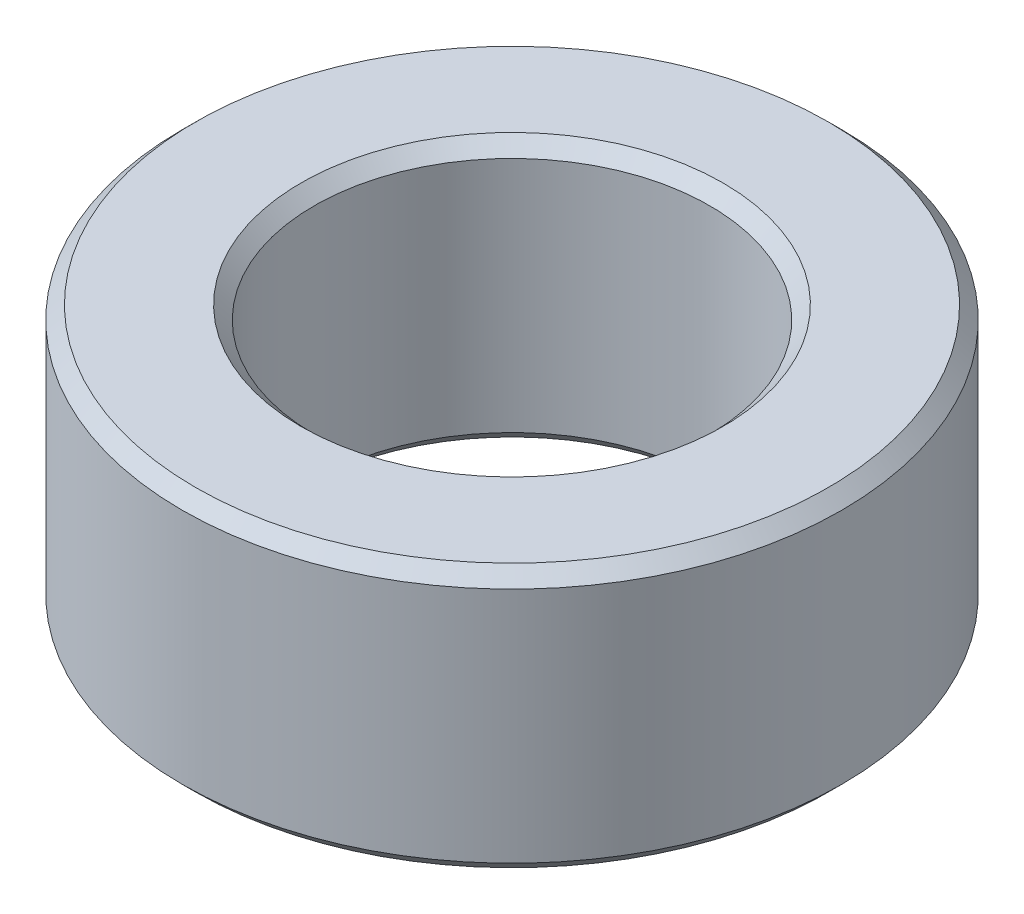
ISO-10303-21;
HEADER;
FILE_DESCRIPTION(('STEP AP214'),'2;1');
FILE_NAME('part.step','',(''),(''),'','','');
FILE_SCHEMA(('AUTOMOTIVE_DESIGN { 1 0 10303 214 1 1 1 1 }'));
ENDSEC;
DATA;
#1=APPLICATION_CONTEXT('core data for automotive mechanical design processes');
#2=APPLICATION_PROTOCOL_DEFINITION('international standard','automotive_design',2000,#1);
#3=PRODUCT_CONTEXT('',#1,'mechanical');
#4=PRODUCT('Part','Part','',(#3));
#5=PRODUCT_RELATED_PRODUCT_CATEGORY('part','',(#4));
#6=PRODUCT_DEFINITION_FORMATION('','',#4);
#7=PRODUCT_DEFINITION_CONTEXT('part definition',#1,'design');
#8=PRODUCT_DEFINITION('design','',#6,#7);
#9=PRODUCT_DEFINITION_SHAPE('','',#8);
#10=(LENGTH_UNIT() NAMED_UNIT(*) SI_UNIT(.MILLI.,.METRE.));
#11=(NAMED_UNIT(*) PLANE_ANGLE_UNIT() SI_UNIT($,.RADIAN.));
#12=(NAMED_UNIT(*) SI_UNIT($,.STERADIAN.) SOLID_ANGLE_UNIT());
#13=UNCERTAINTY_MEASURE_WITH_UNIT(LENGTH_MEASURE(1.E-05),#10,'distance_accuracy_value','');
#14=(GEOMETRIC_REPRESENTATION_CONTEXT(3) GLOBAL_UNCERTAINTY_ASSIGNED_CONTEXT((#13)) GLOBAL_UNIT_ASSIGNED_CONTEXT((#10,
#11,#12)) REPRESENTATION_CONTEXT('',''));
#15=CARTESIAN_POINT('',(0.,0.,0.));
#16=DIRECTION('',(0.,0.,1.));
#17=DIRECTION('',(1.,0.,0.));
#18=AXIS2_PLACEMENT_3D('',#15,#16,#17);
#19=CARTESIAN_POINT('',(0.,4.,0.));
#20=DIRECTION('',(0.,-1.,0.));
#21=DIRECTION('',(0.,0.,-1.));
#22=AXIS2_PLACEMENT_3D('',#19,#20,#21);
#23=CYLINDRICAL_SURFACE('',#22,3.);
#24=CARTESIAN_POINT('',(0.,0.200000000000001,0.));
#25=DIRECTION('',(0.,1.,0.));
#26=DIRECTION('',(0.,0.,1.));
#27=AXIS2_PLACEMENT_3D('',#24,#25,#26);
#28=CIRCLE('',#27,3.);
#29=CARTESIAN_POINT('',(0.,0.200000000000001,3.));
#30=VERTEX_POINT('',#29);
#31=EDGE_CURVE('E63',#30,#30,#28,.F.);
#32=ORIENTED_EDGE('',*,*,#31,.T.);
#33=EDGE_LOOP('',(#32));
#34=FACE_BOUND('',#33,.T.);
#35=CARTESIAN_POINT('',(0.,3.8,0.));
#36=DIRECTION('',(0.,1.,0.));
#37=DIRECTION('',(0.,0.,1.));
#38=AXIS2_PLACEMENT_3D('',#35,#36,#37);
#39=CIRCLE('',#38,3.);
#40=CARTESIAN_POINT('',(0.,3.8,3.));
#41=VERTEX_POINT('',#40);
#42=EDGE_CURVE('E67',#41,#41,#39,.T.);
#43=ORIENTED_EDGE('',*,*,#42,.T.);
#44=EDGE_LOOP('',(#43));
#45=FACE_BOUND('',#44,.T.);
#46=ADVANCED_FACE('F39',(#34,#45),#23,.F.);
#47=CARTESIAN_POINT('',(0.,4.,0.));
#48=DIRECTION('',(0.,-1.,0.));
#49=DIRECTION('',(0.,0.,-1.));
#50=AXIS2_PLACEMENT_3D('',#47,#48,#49);
#51=CYLINDRICAL_SURFACE('',#50,5.);
#52=CARTESIAN_POINT('',(0.,0.200000000000001,0.));
#53=DIRECTION('',(0.,1.,0.));
#54=DIRECTION('',(0.,0.,1.));
#55=AXIS2_PLACEMENT_3D('',#52,#53,#54);
#56=CIRCLE('',#55,5.);
#57=CARTESIAN_POINT('',(0.,0.200000000000001,5.));
#58=VERTEX_POINT('',#57);
#59=EDGE_CURVE('E10',#58,#58,#56,.T.);
#60=ORIENTED_EDGE('',*,*,#59,.T.);
#61=EDGE_LOOP('',(#60));
#62=FACE_BOUND('',#61,.T.);
#63=CARTESIAN_POINT('',(0.,3.8,0.));
#64=DIRECTION('',(0.,1.,0.));
#65=DIRECTION('',(0.,0.,1.));
#66=AXIS2_PLACEMENT_3D('',#63,#64,#65);
#67=CIRCLE('',#66,5.);
#68=CARTESIAN_POINT('',(0.,3.8,5.));
#69=VERTEX_POINT('',#68);
#70=EDGE_CURVE('E47',#69,#69,#67,.F.);
#71=ORIENTED_EDGE('',*,*,#70,.T.);
#72=EDGE_LOOP('',(#71));
#73=FACE_BOUND('',#72,.T.);
#74=ADVANCED_FACE('F95',(#62,#73),#51,.T.);
#75=CARTESIAN_POINT('',(0.,4.,0.));
#76=DIRECTION('',(0.,1.,0.));
#77=DIRECTION('',(0.,0.,1.));
#78=AXIS2_PLACEMENT_3D('',#75,#76,#77);
#79=PLANE('',#78);
#80=CARTESIAN_POINT('',(0.,4.,0.));
#81=DIRECTION('',(0.,1.,0.));
#82=DIRECTION('',(0.,0.,1.));
#83=AXIS2_PLACEMENT_3D('',#80,#81,#82);
#84=CIRCLE('',#83,3.2);
#85=CARTESIAN_POINT('',(0.,4.,3.2));
#86=VERTEX_POINT('',#85);
#87=EDGE_CURVE('E52',#86,#86,#84,.F.);
#88=ORIENTED_EDGE('',*,*,#87,.T.);
#89=EDGE_LOOP('',(#88));
#90=FACE_BOUND('',#89,.T.);
#91=CARTESIAN_POINT('',(0.,4.,0.));
#92=DIRECTION('',(0.,1.,0.));
#93=DIRECTION('',(0.,0.,1.));
#94=AXIS2_PLACEMENT_3D('',#91,#92,#93);
#95=CIRCLE('',#94,4.8);
#96=CARTESIAN_POINT('',(0.,4.,4.8));
#97=VERTEX_POINT('',#96);
#98=EDGE_CURVE('E57',#97,#97,#95,.T.);
#99=ORIENTED_EDGE('',*,*,#98,.T.);
#100=EDGE_LOOP('',(#99));
#101=FACE_BOUND('',#100,.T.);
#102=ADVANCED_FACE('F101',(#90,#101),#79,.T.);
#103=CARTESIAN_POINT('',(0.,0.,0.));
#104=DIRECTION('',(0.,1.,0.));
#105=DIRECTION('',(0.,0.,1.));
#106=AXIS2_PLACEMENT_3D('',#103,#104,#105);
#107=PLANE('',#106);
#108=CARTESIAN_POINT('',(0.,0.,0.));
#109=DIRECTION('',(0.,1.,0.));
#110=DIRECTION('',(0.,0.,1.));
#111=AXIS2_PLACEMENT_3D('',#108,#109,#110);
#112=CIRCLE('',#111,3.2);
#113=CARTESIAN_POINT('',(0.,0.,3.2));
#114=VERTEX_POINT('',#113);
#115=EDGE_CURVE('E71',#114,#114,#112,.T.);
#116=ORIENTED_EDGE('',*,*,#115,.T.);
#117=EDGE_LOOP('',(#116));
#118=FACE_BOUND('',#117,.T.);
#119=CARTESIAN_POINT('',(0.,0.,0.));
#120=DIRECTION('',(0.,1.,0.));
#121=DIRECTION('',(0.,0.,1.));
#122=AXIS2_PLACEMENT_3D('',#119,#120,#121);
#123=CIRCLE('',#122,4.8);
#124=CARTESIAN_POINT('',(0.,0.,4.8));
#125=VERTEX_POINT('',#124);
#126=EDGE_CURVE('E75',#125,#125,#123,.F.);
#127=ORIENTED_EDGE('',*,*,#126,.T.);
#128=EDGE_LOOP('',(#127));
#129=FACE_BOUND('',#128,.T.);
#130=ADVANCED_FACE('F80',(#118,#129),#107,.F.);
#131=CARTESIAN_POINT('',(0.,0.,0.));
#132=DIRECTION('',(0.,-1.,0.));
#133=DIRECTION('',(0.,0.,-1.));
#134=AXIS2_PLACEMENT_3D('',#131,#132,#133);
#135=CONICAL_SURFACE('',#134,3.2,0.785398163397444);
#136=ORIENTED_EDGE('',*,*,#31,.F.);
#137=EDGE_LOOP('',(#136));
#138=FACE_BOUND('',#137,.T.);
#139=ORIENTED_EDGE('',*,*,#115,.F.);
#140=EDGE_LOOP('',(#139));
#141=FACE_BOUND('',#140,.T.);
#142=ADVANCED_FACE('F91',(#138,#141),#135,.F.);
#143=CARTESIAN_POINT('',(0.,3.8,0.));
#144=DIRECTION('',(0.,1.,0.));
#145=DIRECTION('',(0.,0.,1.));
#146=AXIS2_PLACEMENT_3D('',#143,#144,#145);
#147=CONICAL_SURFACE('',#146,3.,0.78539816339745);
#148=ORIENTED_EDGE('',*,*,#87,.F.);
#149=EDGE_LOOP('',(#148));
#150=FACE_BOUND('',#149,.T.);
#151=ORIENTED_EDGE('',*,*,#42,.F.);
#152=EDGE_LOOP('',(#151));
#153=FACE_BOUND('',#152,.T.);
#154=ADVANCED_FACE('F85',(#150,#153),#147,.F.);
#155=CARTESIAN_POINT('',(0.,0.200000000000001,0.));
#156=DIRECTION('',(0.,1.,0.));
#157=DIRECTION('',(0.,0.,1.));
#158=AXIS2_PLACEMENT_3D('',#155,#156,#157);
#159=CONICAL_SURFACE('',#158,5.,0.785398163397448);
#160=ORIENTED_EDGE('',*,*,#126,.F.);
#161=EDGE_LOOP('',(#160));
#162=FACE_BOUND('',#161,.T.);
#163=ORIENTED_EDGE('',*,*,#59,.F.);
#164=EDGE_LOOP('',(#163));
#165=FACE_BOUND('',#164,.T.);
#166=ADVANCED_FACE('F82',(#162,#165),#159,.T.);
#167=CARTESIAN_POINT('',(0.,4.,0.));
#168=DIRECTION('',(0.,-1.,0.));
#169=DIRECTION('',(0.,0.,-1.));
#170=AXIS2_PLACEMENT_3D('',#167,#168,#169);
#171=CONICAL_SURFACE('',#170,4.8,0.785398163397442);
#172=ORIENTED_EDGE('',*,*,#70,.F.);
#173=EDGE_LOOP('',(#172));
#174=FACE_BOUND('',#173,.T.);
#175=ORIENTED_EDGE('',*,*,#98,.F.);
#176=EDGE_LOOP('',(#175));
#177=FACE_BOUND('',#176,.T.);
#178=ADVANCED_FACE('F41',(#174,#177),#171,.T.);
#179=CLOSED_SHELL('',(#46,#74,#102,#130,#142,#154,#166,#178));
#180=MANIFOLD_SOLID_BREP('B2',#179);
#181=ADVANCED_BREP_SHAPE_REPRESENTATION('',(#18,#180),#14);
#182=SHAPE_DEFINITION_REPRESENTATION(#9,#181);
ENDSEC;
END-ISO-10303-21;
